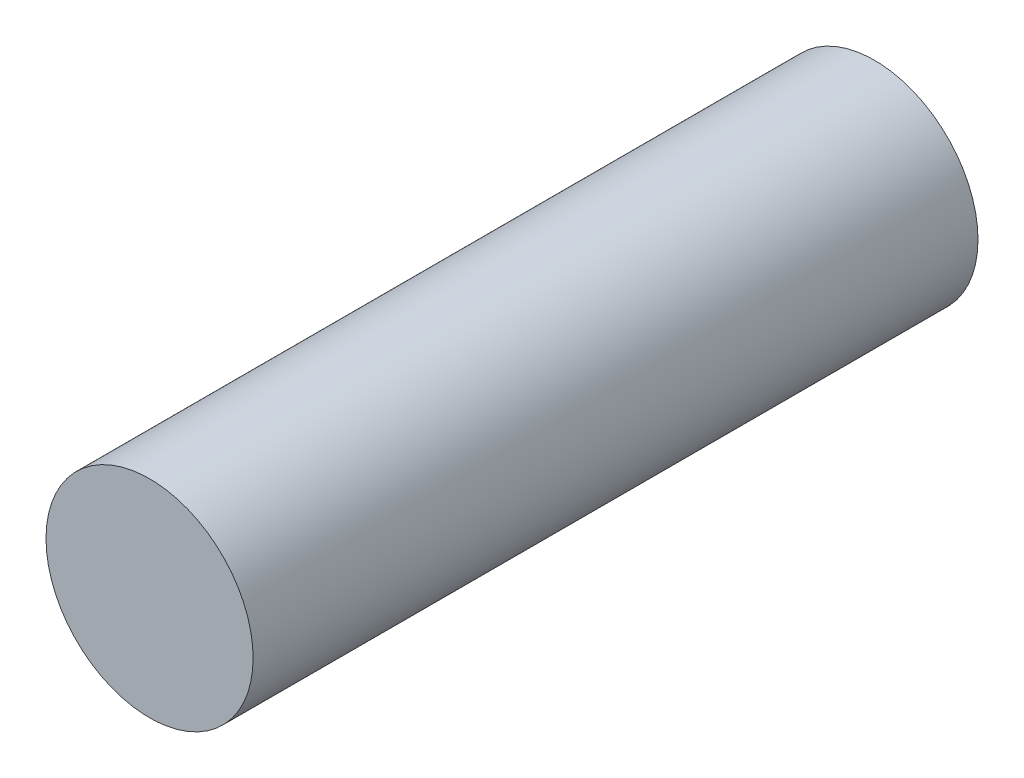
ISO-10303-21;
HEADER;
FILE_DESCRIPTION(('STEP AP214'),'2;1');
FILE_NAME('part.step','',(''),(''),'','','');
FILE_SCHEMA(('AUTOMOTIVE_DESIGN { 1 0 10303 214 1 1 1 1 }'));
ENDSEC;
DATA;
#1=APPLICATION_CONTEXT('core data for automotive mechanical design processes');
#2=APPLICATION_PROTOCOL_DEFINITION('international standard','automotive_design',2000,#1);
#3=PRODUCT_CONTEXT('',#1,'mechanical');
#4=PRODUCT('Part','Part','',(#3));
#5=PRODUCT_RELATED_PRODUCT_CATEGORY('part','',(#4));
#6=PRODUCT_DEFINITION_FORMATION('','',#4);
#7=PRODUCT_DEFINITION_CONTEXT('part definition',#1,'design');
#8=PRODUCT_DEFINITION('design','',#6,#7);
#9=PRODUCT_DEFINITION_SHAPE('','',#8);
#10=(LENGTH_UNIT() NAMED_UNIT(*) SI_UNIT(.MILLI.,.METRE.));
#11=(NAMED_UNIT(*) PLANE_ANGLE_UNIT() SI_UNIT($,.RADIAN.));
#12=(NAMED_UNIT(*) SI_UNIT($,.STERADIAN.) SOLID_ANGLE_UNIT());
#13=UNCERTAINTY_MEASURE_WITH_UNIT(LENGTH_MEASURE(1.E-05),#10,'distance_accuracy_value','');
#14=(GEOMETRIC_REPRESENTATION_CONTEXT(3) GLOBAL_UNCERTAINTY_ASSIGNED_CONTEXT((#13)) GLOBAL_UNIT_ASSIGNED_CONTEXT((#10,
#11,#12)) REPRESENTATION_CONTEXT('',''));
#15=CARTESIAN_POINT('',(0.,0.,0.));
#16=DIRECTION('',(0.,0.,1.));
#17=DIRECTION('',(1.,0.,0.));
#18=AXIS2_PLACEMENT_3D('',#15,#16,#17);
#19=CARTESIAN_POINT('',(0.,0.,7.));
#20=DIRECTION('',(0.,0.,-1.));
#21=DIRECTION('',(-1.,0.,0.));
#22=AXIS2_PLACEMENT_3D('',#19,#20,#21);
#23=CYLINDRICAL_SURFACE('',#22,1.);
#24=CARTESIAN_POINT('',(0.,0.,7.));
#25=DIRECTION('',(0.,0.,1.));
#26=DIRECTION('',(1.,0.,0.));
#27=AXIS2_PLACEMENT_3D('',#24,#25,#26);
#28=CIRCLE('',#27,1.);
#29=CARTESIAN_POINT('',(1.,0.,7.));
#30=VERTEX_POINT('',#29);
#31=EDGE_CURVE('E10',#30,#30,#28,.T.);
#32=ORIENTED_EDGE('',*,*,#31,.F.);
#33=EDGE_LOOP('',(#32));
#34=FACE_BOUND('',#33,.T.);
#35=CARTESIAN_POINT('',(0.,0.,0.));
#36=DIRECTION('',(0.,0.,1.));
#37=DIRECTION('',(1.,0.,0.));
#38=AXIS2_PLACEMENT_3D('',#35,#36,#37);
#39=CIRCLE('',#38,1.);
#40=CARTESIAN_POINT('',(1.,0.,0.));
#41=VERTEX_POINT('',#40);
#42=EDGE_CURVE('E41',#41,#41,#39,.T.);
#43=ORIENTED_EDGE('',*,*,#42,.T.);
#44=EDGE_LOOP('',(#43));
#45=FACE_BOUND('',#44,.T.);
#46=ADVANCED_FACE('F38',(#34,#45),#23,.T.);
#47=CARTESIAN_POINT('',(0.,0.,7.));
#48=DIRECTION('',(0.,0.,1.));
#49=DIRECTION('',(1.,0.,0.));
#50=AXIS2_PLACEMENT_3D('',#47,#48,#49);
#51=PLANE('',#50);
#52=ORIENTED_EDGE('',*,*,#31,.T.);
#53=EDGE_LOOP('',(#52));
#54=FACE_BOUND('',#53,.T.);
#55=ADVANCED_FACE('F55',(#54),#51,.T.);
#56=CARTESIAN_POINT('',(0.,0.,0.));
#57=DIRECTION('',(0.,0.,1.));
#58=DIRECTION('',(1.,0.,0.));
#59=AXIS2_PLACEMENT_3D('',#56,#57,#58);
#60=PLANE('',#59);
#61=ORIENTED_EDGE('',*,*,#42,.F.);
#62=EDGE_LOOP('',(#61));
#63=FACE_BOUND('',#62,.T.);
#64=ADVANCED_FACE('F53',(#63),#60,.F.);
#65=CLOSED_SHELL('',(#46,#55,#64));
#66=MANIFOLD_SOLID_BREP('B2',#65);
#67=ADVANCED_BREP_SHAPE_REPRESENTATION('',(#18,#66),#14);
#68=SHAPE_DEFINITION_REPRESENTATION(#9,#67);
ENDSEC;
END-ISO-10303-21;
